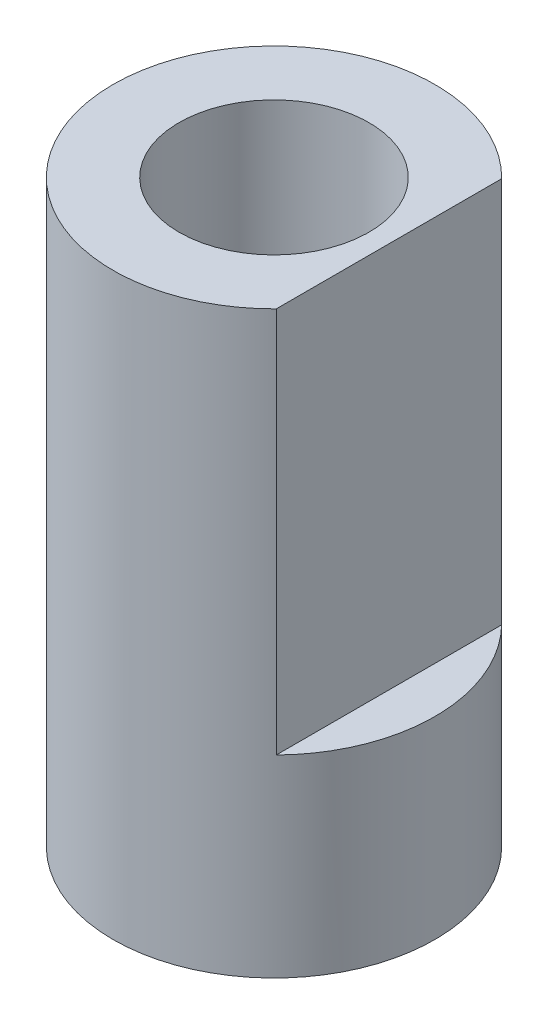
ISO-10303-21;
HEADER;
FILE_DESCRIPTION(('STEP AP214'),'2;1');
FILE_NAME('part.step','',(''),(''),'','','');
FILE_SCHEMA(('AUTOMOTIVE_DESIGN { 1 0 10303 214 1 1 1 1 }'));
ENDSEC;
DATA;
#1=APPLICATION_CONTEXT('core data for automotive mechanical design processes');
#2=APPLICATION_PROTOCOL_DEFINITION('international standard','automotive_design',2000,#1);
#3=PRODUCT_CONTEXT('',#1,'mechanical');
#4=PRODUCT('Part','Part','',(#3));
#5=PRODUCT_RELATED_PRODUCT_CATEGORY('part','',(#4));
#6=PRODUCT_DEFINITION_FORMATION('','',#4);
#7=PRODUCT_DEFINITION_CONTEXT('part definition',#1,'design');
#8=PRODUCT_DEFINITION('design','',#6,#7);
#9=PRODUCT_DEFINITION_SHAPE('','',#8);
#10=(LENGTH_UNIT() NAMED_UNIT(*) SI_UNIT(.MILLI.,.METRE.));
#11=(NAMED_UNIT(*) PLANE_ANGLE_UNIT() SI_UNIT($,.RADIAN.));
#12=(NAMED_UNIT(*) SI_UNIT($,.STERADIAN.) SOLID_ANGLE_UNIT());
#13=UNCERTAINTY_MEASURE_WITH_UNIT(LENGTH_MEASURE(1.E-05),#10,'distance_accuracy_value','');
#14=(GEOMETRIC_REPRESENTATION_CONTEXT(3) GLOBAL_UNCERTAINTY_ASSIGNED_CONTEXT((#13)) GLOBAL_UNIT_ASSIGNED_CONTEXT((#10,
#11,#12)) REPRESENTATION_CONTEXT('',''));
#15=CARTESIAN_POINT('',(0.,0.,0.));
#16=DIRECTION('',(0.,0.,1.));
#17=DIRECTION('',(1.,0.,0.));
#18=AXIS2_PLACEMENT_3D('',#15,#16,#17);
#19=CARTESIAN_POINT('',(0.,3.,0.));
#20=DIRECTION('',(0.,1.,0.));
#21=DIRECTION('',(0.,0.,1.));
#22=AXIS2_PLACEMENT_3D('',#19,#20,#21);
#23=PLANE('',#22);
#24=CARTESIAN_POINT('',(0.,3.,0.));
#25=DIRECTION('',(0.,1.,0.));
#26=DIRECTION('',(0.,0.,1.));
#27=AXIS2_PLACEMENT_3D('',#24,#25,#26);
#28=CIRCLE('',#27,2.5);
#29=CARTESIAN_POINT('',(1.78535710713571,3.,1.75));
#30=VERTEX_POINT('',#29);
#31=CARTESIAN_POINT('',(1.78535710713571,3.,-1.75));
#32=VERTEX_POINT('',#31);
#33=EDGE_CURVE('E12',#30,#32,#28,.T.);
#34=ORIENTED_EDGE('',*,*,#33,.T.);
#35=DIRECTION('',(0.,0.,1.));
#36=VECTOR('',#35,1.);
#37=CARTESIAN_POINT('',(1.78535710713571,3.,0.));
#38=LINE('',#37,#36);
#39=EDGE_CURVE('E83',#32,#30,#38,.T.);
#40=ORIENTED_EDGE('',*,*,#39,.T.);
#41=EDGE_LOOP('',(#34,#40));
#42=FACE_BOUND('',#41,.T.);
#43=ADVANCED_FACE('F48',(#42),#23,.T.);
#44=CARTESIAN_POINT('',(0.,3.,0.));
#45=DIRECTION('',(0.,-1.,0.));
#46=DIRECTION('',(0.,0.,-1.));
#47=AXIS2_PLACEMENT_3D('',#44,#45,#46);
#48=CYLINDRICAL_SURFACE('',#47,1.475);
#49=CARTESIAN_POINT('',(0.,0.,0.));
#50=DIRECTION('',(0.,1.,0.));
#51=DIRECTION('',(0.,0.,1.));
#52=AXIS2_PLACEMENT_3D('',#49,#50,#51);
#53=CIRCLE('',#52,1.475);
#54=CARTESIAN_POINT('',(0.,0.,1.475));
#55=VERTEX_POINT('',#54);
#56=EDGE_CURVE('E159',#55,#55,#53,.T.);
#57=ORIENTED_EDGE('',*,*,#56,.F.);
#58=EDGE_LOOP('',(#57));
#59=FACE_BOUND('',#58,.T.);
#60=CARTESIAN_POINT('',(0.,9.,0.));
#61=DIRECTION('',(0.,1.,0.));
#62=DIRECTION('',(0.,0.,1.));
#63=AXIS2_PLACEMENT_3D('',#60,#61,#62);
#64=CIRCLE('',#63,1.475);
#65=CARTESIAN_POINT('',(0.,9.,1.475));
#66=VERTEX_POINT('',#65);
#67=EDGE_CURVE('E86',#66,#66,#64,.T.);
#68=ORIENTED_EDGE('',*,*,#67,.T.);
#69=EDGE_LOOP('',(#68));
#70=FACE_BOUND('',#69,.T.);
#71=ADVANCED_FACE('F50',(#59,#70),#48,.F.);
#72=CARTESIAN_POINT('',(0.,3.,0.));
#73=DIRECTION('',(0.,-1.,0.));
#74=DIRECTION('',(0.,0.,-1.));
#75=AXIS2_PLACEMENT_3D('',#72,#73,#74);
#76=CYLINDRICAL_SURFACE('',#75,2.5);
#77=ORIENTED_EDGE('',*,*,#33,.F.);
#78=DIRECTION('',(0.,-1.,0.));
#79=VECTOR('',#78,1.);
#80=CARTESIAN_POINT('',(1.78535710713571,9.,1.75));
#81=LINE('',#80,#79);
#82=CARTESIAN_POINT('',(1.78535710713571,9.,1.75));
#83=VERTEX_POINT('',#82);
#84=EDGE_CURVE('E64',#83,#30,#81,.T.);
#85=ORIENTED_EDGE('',*,*,#84,.F.);
#86=CARTESIAN_POINT('',(0.,9.,0.));
#87=DIRECTION('',(0.,1.,0.));
#88=DIRECTION('',(0.,0.,1.));
#89=AXIS2_PLACEMENT_3D('',#86,#87,#88);
#90=CIRCLE('',#89,2.5);
#91=CARTESIAN_POINT('',(1.78535710713571,9.,-1.75));
#92=VERTEX_POINT('',#91);
#93=EDGE_CURVE('E79',#92,#83,#90,.T.);
#94=ORIENTED_EDGE('',*,*,#93,.F.);
#95=DIRECTION('',(0.,-1.,0.));
#96=VECTOR('',#95,1.);
#97=CARTESIAN_POINT('',(1.78535710713571,9.,-1.75));
#98=LINE('',#97,#96);
#99=EDGE_CURVE('E70',#92,#32,#98,.T.);
#100=ORIENTED_EDGE('',*,*,#99,.T.);
#101=EDGE_LOOP('',(#77,#85,#94,#100));
#102=FACE_BOUND('',#101,.T.);
#103=CARTESIAN_POINT('',(0.,0.,0.));
#104=DIRECTION('',(0.,1.,0.));
#105=DIRECTION('',(0.,0.,1.));
#106=AXIS2_PLACEMENT_3D('',#103,#104,#105);
#107=CIRCLE('',#106,2.5);
#108=CARTESIAN_POINT('',(0.,0.,2.5));
#109=VERTEX_POINT('',#108);
#110=EDGE_CURVE('E52',#109,#109,#107,.T.);
#111=ORIENTED_EDGE('',*,*,#110,.T.);
#112=EDGE_LOOP('',(#111));
#113=FACE_BOUND('',#112,.T.);
#114=ADVANCED_FACE('F77',(#102,#113),#76,.T.);
#115=CARTESIAN_POINT('',(0.,0.,0.));
#116=DIRECTION('',(0.,1.,0.));
#117=DIRECTION('',(0.,0.,1.));
#118=AXIS2_PLACEMENT_3D('',#115,#116,#117);
#119=PLANE('',#118);
#120=ORIENTED_EDGE('',*,*,#56,.T.);
#121=EDGE_LOOP('',(#120));
#122=FACE_BOUND('',#121,.T.);
#123=ORIENTED_EDGE('',*,*,#110,.F.);
#124=EDGE_LOOP('',(#123));
#125=FACE_BOUND('',#124,.T.);
#126=ADVANCED_FACE('F97',(#122,#125),#119,.F.);
#127=CARTESIAN_POINT('',(0.,9.,0.));
#128=DIRECTION('',(0.,1.,0.));
#129=DIRECTION('',(0.,0.,1.));
#130=AXIS2_PLACEMENT_3D('',#127,#128,#129);
#131=PLANE('',#130);
#132=ORIENTED_EDGE('',*,*,#93,.T.);
#133=DIRECTION('',(0.,0.,1.));
#134=VECTOR('',#133,1.);
#135=CARTESIAN_POINT('',(1.78535710713571,9.,0.));
#136=LINE('',#135,#134);
#137=EDGE_CURVE('E81',#92,#83,#136,.T.);
#138=ORIENTED_EDGE('',*,*,#137,.F.);
#139=EDGE_LOOP('',(#132,#138));
#140=FACE_BOUND('',#139,.T.);
#141=ORIENTED_EDGE('',*,*,#67,.F.);
#142=EDGE_LOOP('',(#141));
#143=FACE_BOUND('',#142,.T.);
#144=ADVANCED_FACE('F99',(#140,#143),#131,.T.);
#145=CARTESIAN_POINT('',(1.78535710713571,9.,0.));
#146=DIRECTION('',(1.,0.,0.));
#147=DIRECTION('',(0.,0.,-1.));
#148=AXIS2_PLACEMENT_3D('',#145,#146,#147);
#149=PLANE('',#148);
#150=ORIENTED_EDGE('',*,*,#39,.F.);
#151=ORIENTED_EDGE('',*,*,#99,.F.);
#152=ORIENTED_EDGE('',*,*,#137,.T.);
#153=ORIENTED_EDGE('',*,*,#84,.T.);
#154=EDGE_LOOP('',(#150,#151,#152,#153));
#155=FACE_BOUND('',#154,.T.);
#156=ADVANCED_FACE('F84',(#155),#149,.T.);
#157=CLOSED_SHELL('',(#43,#71,#114,#126,#144,#156));
#158=MANIFOLD_SOLID_BREP('B2',#157);
#159=ADVANCED_BREP_SHAPE_REPRESENTATION('',(#18,#158),#14);
#160=SHAPE_DEFINITION_REPRESENTATION(#9,#159);
ENDSEC;
END-ISO-10303-21;
